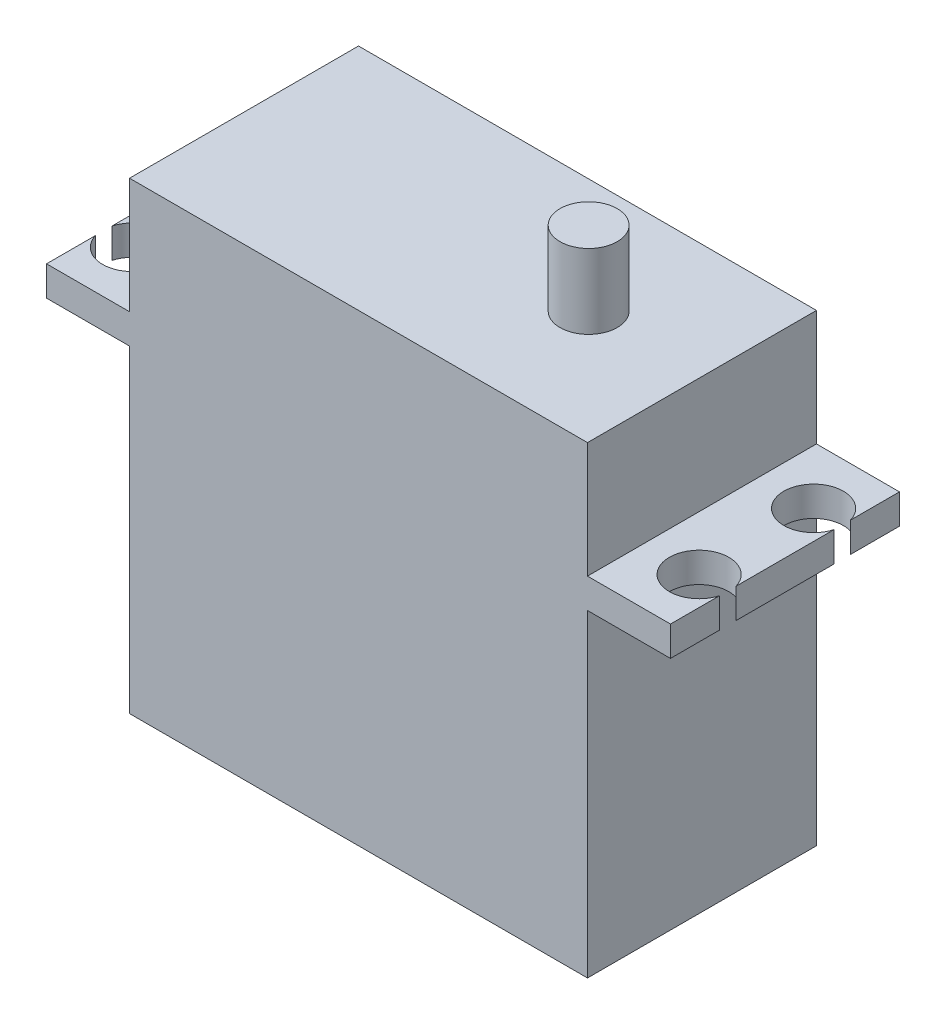
ISO-10303-21;
HEADER;
FILE_DESCRIPTION(('STEP AP214'),'2;1');
FILE_NAME('part.step','',(''),(''),'','','');
FILE_SCHEMA(('AUTOMOTIVE_DESIGN { 1 0 10303 214 1 1 1 1 }'));
ENDSEC;
DATA;
#1=APPLICATION_CONTEXT('core data for automotive mechanical design processes');
#2=APPLICATION_PROTOCOL_DEFINITION('international standard','automotive_design',2000,#1);
#3=PRODUCT_CONTEXT('',#1,'mechanical');
#4=PRODUCT('Part','Part','',(#3));
#5=PRODUCT_RELATED_PRODUCT_CATEGORY('part','',(#4));
#6=PRODUCT_DEFINITION_FORMATION('','',#4);
#7=PRODUCT_DEFINITION_CONTEXT('part definition',#1,'design');
#8=PRODUCT_DEFINITION('design','',#6,#7);
#9=PRODUCT_DEFINITION_SHAPE('','',#8);
#10=(LENGTH_UNIT() NAMED_UNIT(*) SI_UNIT(.MILLI.,.METRE.));
#11=(NAMED_UNIT(*) PLANE_ANGLE_UNIT() SI_UNIT($,.RADIAN.));
#12=(NAMED_UNIT(*) SI_UNIT($,.STERADIAN.) SOLID_ANGLE_UNIT());
#13=UNCERTAINTY_MEASURE_WITH_UNIT(LENGTH_MEASURE(1.E-05),#10,'distance_accuracy_value','');
#14=(GEOMETRIC_REPRESENTATION_CONTEXT(3) GLOBAL_UNCERTAINTY_ASSIGNED_CONTEXT((#13)) GLOBAL_UNIT_ASSIGNED_CONTEXT((#10,
#11,#12)) REPRESENTATION_CONTEXT('',''));
#15=CARTESIAN_POINT('',(0.,0.,0.));
#16=DIRECTION('',(0.,0.,1.));
#17=DIRECTION('',(1.,0.,0.));
#18=AXIS2_PLACEMENT_3D('',#15,#16,#17);
#19=CARTESIAN_POINT('',(-7.25,0.,0.));
#20=DIRECTION('',(-1.,0.,0.));
#21=DIRECTION('',(0.,0.,1.));
#22=AXIS2_PLACEMENT_3D('',#19,#20,#21);
#23=PLANE('',#22);
#24=DIRECTION('',(0.,1.,0.));
#25=VECTOR('',#24,1.);
#26=CARTESIAN_POINT('',(-7.25,23.15,15.7141428428543));
#27=LINE('',#26,#25);
#28=CARTESIAN_POINT('',(-7.25,27.8,15.7141428428543));
#29=VERTEX_POINT('',#28);
#30=CARTESIAN_POINT('',(-7.25,30.4,15.7141428428543));
#31=VERTEX_POINT('',#30);
#32=EDGE_CURVE('E11',#29,#31,#27,.T.);
#33=ORIENTED_EDGE('',*,*,#32,.F.);
#34=DIRECTION('',(0.,0.,-1.));
#35=VECTOR('',#34,1.);
#36=CARTESIAN_POINT('',(-7.25,27.8,0.));
#37=LINE('',#36,#35);
#38=CARTESIAN_POINT('',(-7.25,27.8,20.));
#39=VERTEX_POINT('',#38);
#40=EDGE_CURVE('E238',#39,#29,#37,.T.);
#41=ORIENTED_EDGE('',*,*,#40,.F.);
#42=DIRECTION('',(0.,1.,0.));
#43=VECTOR('',#42,1.);
#44=CARTESIAN_POINT('',(-7.25,0.,20.));
#45=LINE('',#44,#43);
#46=CARTESIAN_POINT('',(-7.25,30.4,20.));
#47=VERTEX_POINT('',#46);
#48=EDGE_CURVE('E241',#39,#47,#45,.T.);
#49=ORIENTED_EDGE('',*,*,#48,.T.);
#50=DIRECTION('',(0.,0.,1.));
#51=VECTOR('',#50,1.);
#52=CARTESIAN_POINT('',(-7.25,30.4,0.));
#53=LINE('',#52,#51);
#54=EDGE_CURVE('E234',#31,#47,#53,.T.);
#55=ORIENTED_EDGE('',*,*,#54,.F.);
#56=EDGE_LOOP('',(#33,#41,#49,#55));
#57=FACE_BOUND('',#56,.T.);
#58=ADVANCED_FACE('F34',(#57),#23,.T.);
#59=DIRECTION('',(0.,1.,0.));
#60=VECTOR('',#59,1.);
#61=CARTESIAN_POINT('',(-7.25,23.15,14.2858571571457));
#62=LINE('',#61,#60);
#63=CARTESIAN_POINT('',(-7.25,30.4,14.2858571571457));
#64=VERTEX_POINT('',#63);
#65=CARTESIAN_POINT('',(-7.25,27.8,14.2858571571457));
#66=VERTEX_POINT('',#65);
#67=EDGE_CURVE('E42',#64,#66,#62,.F.);
#68=ORIENTED_EDGE('',*,*,#67,.F.);
#69=CARTESIAN_POINT('',(-7.25,30.4,5.71414284285429));
#70=VERTEX_POINT('',#69);
#71=EDGE_CURVE('E233',#70,#64,#53,.T.);
#72=ORIENTED_EDGE('',*,*,#71,.F.);
#73=DIRECTION('',(0.,1.,0.));
#74=VECTOR('',#73,1.);
#75=CARTESIAN_POINT('',(-7.25,23.15,5.71414284285429));
#76=LINE('',#75,#74);
#77=CARTESIAN_POINT('',(-7.25,27.8,5.71414284285429));
#78=VERTEX_POINT('',#77);
#79=EDGE_CURVE('E306',#78,#70,#76,.T.);
#80=ORIENTED_EDGE('',*,*,#79,.F.);
#81=EDGE_CURVE('E242',#66,#78,#37,.T.);
#82=ORIENTED_EDGE('',*,*,#81,.F.);
#83=EDGE_LOOP('',(#68,#72,#80,#82));
#84=FACE_BOUND('',#83,.T.);
#85=ADVANCED_FACE('F321',(#84),#23,.T.);
#86=CARTESIAN_POINT('',(47.25,0.,0.));
#87=DIRECTION('',(1.,0.,0.));
#88=DIRECTION('',(0.,0.,-1.));
#89=AXIS2_PLACEMENT_3D('',#86,#87,#88);
#90=PLANE('',#89);
#91=DIRECTION('',(0.,1.,0.));
#92=VECTOR('',#91,1.);
#93=CARTESIAN_POINT('',(47.25,23.15,4.28585715714574));
#94=LINE('',#93,#92);
#95=CARTESIAN_POINT('',(47.25,27.8,4.28585715714573));
#96=VERTEX_POINT('',#95);
#97=CARTESIAN_POINT('',(47.25,30.4,4.28585715714574));
#98=VERTEX_POINT('',#97);
#99=EDGE_CURVE('E302',#96,#98,#94,.T.);
#100=ORIENTED_EDGE('',*,*,#99,.F.);
#101=DIRECTION('',(0.,0.,-1.));
#102=VECTOR('',#101,1.);
#103=CARTESIAN_POINT('',(47.25,27.8,0.));
#104=LINE('',#103,#102);
#105=CARTESIAN_POINT('',(47.25,27.8,0.));
#106=VERTEX_POINT('',#105);
#107=EDGE_CURVE('E204',#96,#106,#104,.T.);
#108=ORIENTED_EDGE('',*,*,#107,.T.);
#109=DIRECTION('',(0.,1.,0.));
#110=VECTOR('',#109,1.);
#111=CARTESIAN_POINT('',(47.25,0.,0.));
#112=LINE('',#111,#110);
#113=CARTESIAN_POINT('',(47.25,30.4,0.));
#114=VERTEX_POINT('',#113);
#115=EDGE_CURVE('E199',#106,#114,#112,.T.);
#116=ORIENTED_EDGE('',*,*,#115,.T.);
#117=DIRECTION('',(0.,0.,1.));
#118=VECTOR('',#117,1.);
#119=CARTESIAN_POINT('',(47.25,30.4,0.));
#120=LINE('',#119,#118);
#121=EDGE_CURVE('E195',#114,#98,#120,.T.);
#122=ORIENTED_EDGE('',*,*,#121,.T.);
#123=EDGE_LOOP('',(#100,#108,#116,#122));
#124=FACE_BOUND('',#123,.T.);
#125=ADVANCED_FACE('F372',(#124),#90,.T.);
#126=DIRECTION('',(0.,1.,0.));
#127=VECTOR('',#126,1.);
#128=CARTESIAN_POINT('',(47.25,23.15,5.71414284285426));
#129=LINE('',#128,#127);
#130=CARTESIAN_POINT('',(47.25,30.4,5.71414284285426));
#131=VERTEX_POINT('',#130);
#132=CARTESIAN_POINT('',(47.25,27.8,5.71414284285426));
#133=VERTEX_POINT('',#132);
#134=EDGE_CURVE('E180',#131,#133,#129,.F.);
#135=ORIENTED_EDGE('',*,*,#134,.F.);
#136=CARTESIAN_POINT('',(47.25,30.4,14.2858571571457));
#137=VERTEX_POINT('',#136);
#138=EDGE_CURVE('E188',#131,#137,#120,.T.);
#139=ORIENTED_EDGE('',*,*,#138,.T.);
#140=DIRECTION('',(0.,1.,0.));
#141=VECTOR('',#140,1.);
#142=CARTESIAN_POINT('',(47.25,23.15,14.2858571571457));
#143=LINE('',#142,#141);
#144=CARTESIAN_POINT('',(47.25,27.8,14.2858571571457));
#145=VERTEX_POINT('',#144);
#146=EDGE_CURVE('E169',#145,#137,#143,.T.);
#147=ORIENTED_EDGE('',*,*,#146,.F.);
#148=EDGE_CURVE('E209',#145,#133,#104,.T.);
#149=ORIENTED_EDGE('',*,*,#148,.T.);
#150=EDGE_LOOP('',(#135,#139,#147,#149));
#151=FACE_BOUND('',#150,.T.);
#152=ADVANCED_FACE('F194',(#151),#90,.T.);
#153=CARTESIAN_POINT('',(40.,40.5,0.));
#154=DIRECTION('',(-1.,0.,0.));
#155=DIRECTION('',(0.,0.,1.));
#156=AXIS2_PLACEMENT_3D('',#153,#154,#155);
#157=PLANE('',#156);
#158=DIRECTION('',(0.,0.,-1.));
#159=VECTOR('',#158,1.);
#160=CARTESIAN_POINT('',(40.,27.8,0.));
#161=LINE('',#160,#159);
#162=CARTESIAN_POINT('',(40.,27.8,20.));
#163=VERTEX_POINT('',#162);
#164=CARTESIAN_POINT('',(40.,27.8,0.));
#165=VERTEX_POINT('',#164);
#166=EDGE_CURVE('E213',#163,#165,#161,.T.);
#167=ORIENTED_EDGE('',*,*,#166,.F.);
#168=DIRECTION('',(0.,-1.,0.));
#169=VECTOR('',#168,1.);
#170=CARTESIAN_POINT('',(40.,40.5,20.));
#171=LINE('',#170,#169);
#172=CARTESIAN_POINT('',(40.,0.,20.));
#173=VERTEX_POINT('',#172);
#174=EDGE_CURVE('E293',#163,#173,#171,.T.);
#175=ORIENTED_EDGE('',*,*,#174,.T.);
#176=DIRECTION('',(0.,0.,-1.));
#177=VECTOR('',#176,1.);
#178=CARTESIAN_POINT('',(40.,0.,0.));
#179=LINE('',#178,#177);
#180=CARTESIAN_POINT('',(40.,0.,0.));
#181=VERTEX_POINT('',#180);
#182=EDGE_CURVE('E281',#173,#181,#179,.T.);
#183=ORIENTED_EDGE('',*,*,#182,.T.);
#184=DIRECTION('',(0.,-1.,0.));
#185=VECTOR('',#184,1.);
#186=CARTESIAN_POINT('',(40.,40.5,0.));
#187=LINE('',#186,#185);
#188=EDGE_CURVE('E289',#165,#181,#187,.T.);
#189=ORIENTED_EDGE('',*,*,#188,.F.);
#190=EDGE_LOOP('',(#167,#175,#183,#189));
#191=FACE_BOUND('',#190,.T.);
#192=ADVANCED_FACE('F381',(#191),#157,.F.);
#193=DIRECTION('',(0.,0.,1.));
#194=VECTOR('',#193,1.);
#195=CARTESIAN_POINT('',(40.,30.4,0.));
#196=LINE('',#195,#194);
#197=CARTESIAN_POINT('',(40.,30.4,0.));
#198=VERTEX_POINT('',#197);
#199=CARTESIAN_POINT('',(40.,30.4,20.));
#200=VERTEX_POINT('',#199);
#201=EDGE_CURVE('E210',#198,#200,#196,.T.);
#202=ORIENTED_EDGE('',*,*,#201,.F.);
#203=CARTESIAN_POINT('',(40.,40.5,0.));
#204=VERTEX_POINT('',#203);
#205=EDGE_CURVE('E290',#204,#198,#187,.T.);
#206=ORIENTED_EDGE('',*,*,#205,.F.);
#207=DIRECTION('',(0.,0.,-1.));
#208=VECTOR('',#207,1.);
#209=CARTESIAN_POINT('',(40.,40.5,0.));
#210=LINE('',#209,#208);
#211=CARTESIAN_POINT('',(40.,40.5,20.));
#212=VERTEX_POINT('',#211);
#213=EDGE_CURVE('E271',#212,#204,#210,.T.);
#214=ORIENTED_EDGE('',*,*,#213,.F.);
#215=EDGE_CURVE('E294',#212,#200,#171,.T.);
#216=ORIENTED_EDGE('',*,*,#215,.T.);
#217=EDGE_LOOP('',(#202,#206,#214,#216));
#218=FACE_BOUND('',#217,.T.);
#219=ADVANCED_FACE('F366',(#218),#157,.F.);
#220=CARTESIAN_POINT('',(0.,40.5,0.));
#221=DIRECTION('',(1.,0.,0.));
#222=DIRECTION('',(0.,0.,-1.));
#223=AXIS2_PLACEMENT_3D('',#220,#221,#222);
#224=PLANE('',#223);
#225=DIRECTION('',(0.,-1.,0.));
#226=VECTOR('',#225,1.);
#227=CARTESIAN_POINT('',(0.,40.5,0.));
#228=LINE('',#227,#226);
#229=CARTESIAN_POINT('',(0.,40.5,0.));
#230=VERTEX_POINT('',#229);
#231=CARTESIAN_POINT('',(0.,30.4,0.));
#232=VERTEX_POINT('',#231);
#233=EDGE_CURVE('E286',#230,#232,#228,.T.);
#234=ORIENTED_EDGE('',*,*,#233,.T.);
#235=DIRECTION('',(0.,0.,1.));
#236=VECTOR('',#235,1.);
#237=CARTESIAN_POINT('',(0.,30.4,0.));
#238=LINE('',#237,#236);
#239=CARTESIAN_POINT('',(0.,30.4,20.));
#240=VERTEX_POINT('',#239);
#241=EDGE_CURVE('E228',#232,#240,#238,.T.);
#242=ORIENTED_EDGE('',*,*,#241,.T.);
#243=DIRECTION('',(0.,-1.,0.));
#244=VECTOR('',#243,1.);
#245=CARTESIAN_POINT('',(0.,40.5,20.));
#246=LINE('',#245,#244);
#247=CARTESIAN_POINT('',(0.,40.5,20.));
#248=VERTEX_POINT('',#247);
#249=EDGE_CURVE('E297',#248,#240,#246,.T.);
#250=ORIENTED_EDGE('',*,*,#249,.F.);
#251=DIRECTION('',(0.,0.,1.));
#252=VECTOR('',#251,1.);
#253=CARTESIAN_POINT('',(0.,40.5,0.));
#254=LINE('',#253,#252);
#255=EDGE_CURVE('E265',#230,#248,#254,.T.);
#256=ORIENTED_EDGE('',*,*,#255,.F.);
#257=EDGE_LOOP('',(#234,#242,#250,#256));
#258=FACE_BOUND('',#257,.T.);
#259=ADVANCED_FACE('F359',(#258),#224,.F.);
#260=CARTESIAN_POINT('',(0.,27.8,20.));
#261=VERTEX_POINT('',#260);
#262=CARTESIAN_POINT('',(0.,0.,20.));
#263=VERTEX_POINT('',#262);
#264=EDGE_CURVE('E296',#261,#263,#246,.T.);
#265=ORIENTED_EDGE('',*,*,#264,.F.);
#266=DIRECTION('',(0.,0.,-1.));
#267=VECTOR('',#266,1.);
#268=CARTESIAN_POINT('',(0.,27.8,0.));
#269=LINE('',#268,#267);
#270=CARTESIAN_POINT('',(0.,27.8,0.));
#271=VERTEX_POINT('',#270);
#272=EDGE_CURVE('E248',#261,#271,#269,.T.);
#273=ORIENTED_EDGE('',*,*,#272,.T.);
#274=CARTESIAN_POINT('',(0.,0.,0.));
#275=VERTEX_POINT('',#274);
#276=EDGE_CURVE('E275',#271,#275,#228,.T.);
#277=ORIENTED_EDGE('',*,*,#276,.T.);
#278=DIRECTION('',(0.,0.,1.));
#279=VECTOR('',#278,1.);
#280=CARTESIAN_POINT('',(0.,0.,0.));
#281=LINE('',#280,#279);
#282=EDGE_CURVE('E262',#275,#263,#281,.T.);
#283=ORIENTED_EDGE('',*,*,#282,.T.);
#284=EDGE_LOOP('',(#265,#273,#277,#283));
#285=FACE_BOUND('',#284,.T.);
#286=ADVANCED_FACE('F36',(#285),#224,.F.);
#287=CARTESIAN_POINT('',(0.,40.5,20.));
#288=DIRECTION('',(0.,0.,-1.));
#289=DIRECTION('',(-1.,0.,0.));
#290=AXIS2_PLACEMENT_3D('',#287,#288,#289);
#291=PLANE('',#290);
#292=DIRECTION('',(1.,0.,0.));
#293=VECTOR('',#292,1.);
#294=CARTESIAN_POINT('',(0.,0.,20.));
#295=LINE('',#294,#293);
#296=EDGE_CURVE('E278',#263,#173,#295,.T.);
#297=ORIENTED_EDGE('',*,*,#296,.T.);
#298=ORIENTED_EDGE('',*,*,#174,.F.);
#299=DIRECTION('',(-1.,0.,0.));
#300=VECTOR('',#299,1.);
#301=CARTESIAN_POINT('',(47.25,27.8,20.));
#302=LINE('',#301,#300);
#303=CARTESIAN_POINT('',(47.25,27.8,20.));
#304=VERTEX_POINT('',#303);
#305=EDGE_CURVE('E219',#304,#163,#302,.T.);
#306=ORIENTED_EDGE('',*,*,#305,.F.);
#307=DIRECTION('',(0.,-1.,0.));
#308=VECTOR('',#307,1.);
#309=CARTESIAN_POINT('',(47.25,0.,20.));
#310=LINE('',#309,#308);
#311=CARTESIAN_POINT('',(47.25,30.4,20.));
#312=VERTEX_POINT('',#311);
#313=EDGE_CURVE('E198',#312,#304,#310,.T.);
#314=ORIENTED_EDGE('',*,*,#313,.F.);
#315=DIRECTION('',(-1.,0.,0.));
#316=VECTOR('',#315,1.);
#317=CARTESIAN_POINT('',(47.25,30.4,20.));
#318=LINE('',#317,#316);
#319=EDGE_CURVE('E222',#312,#200,#318,.T.);
#320=ORIENTED_EDGE('',*,*,#319,.T.);
#321=ORIENTED_EDGE('',*,*,#215,.F.);
#322=DIRECTION('',(1.,0.,0.));
#323=VECTOR('',#322,1.);
#324=CARTESIAN_POINT('',(0.,40.5,20.));
#325=LINE('',#324,#323);
#326=EDGE_CURVE('E268',#248,#212,#325,.T.);
#327=ORIENTED_EDGE('',*,*,#326,.F.);
#328=ORIENTED_EDGE('',*,*,#249,.T.);
#329=DIRECTION('',(1.,0.,0.));
#330=VECTOR('',#329,1.);
#331=CARTESIAN_POINT('',(-7.25,30.4,20.));
#332=LINE('',#331,#330);
#333=EDGE_CURVE('E245',#47,#240,#332,.T.);
#334=ORIENTED_EDGE('',*,*,#333,.F.);
#335=ORIENTED_EDGE('',*,*,#48,.F.);
#336=DIRECTION('',(1.,0.,0.));
#337=VECTOR('',#336,1.);
#338=CARTESIAN_POINT('',(-7.25,27.8,20.));
#339=LINE('',#338,#337);
#340=EDGE_CURVE('E252',#39,#261,#339,.T.);
#341=ORIENTED_EDGE('',*,*,#340,.T.);
#342=ORIENTED_EDGE('',*,*,#264,.T.);
#343=EDGE_LOOP('',(#297,#298,#306,#314,#320,#321,#327,#328,#334,#335,#341,#342));
#344=FACE_BOUND('',#343,.T.);
#345=ADVANCED_FACE('F339',(#344),#291,.F.);
#346=CARTESIAN_POINT('',(0.,40.5,0.));
#347=DIRECTION('',(0.,0.,1.));
#348=DIRECTION('',(1.,0.,0.));
#349=AXIS2_PLACEMENT_3D('',#346,#347,#348);
#350=PLANE('',#349);
#351=DIRECTION('',(-1.,0.,0.));
#352=VECTOR('',#351,1.);
#353=CARTESIAN_POINT('',(0.,0.,0.));
#354=LINE('',#353,#352);
#355=EDGE_CURVE('E269',#181,#275,#354,.T.);
#356=ORIENTED_EDGE('',*,*,#355,.T.);
#357=ORIENTED_EDGE('',*,*,#276,.F.);
#358=DIRECTION('',(1.,0.,0.));
#359=VECTOR('',#358,1.);
#360=CARTESIAN_POINT('',(-7.25,27.8,0.));
#361=LINE('',#360,#359);
#362=CARTESIAN_POINT('',(-7.25,27.8,0.));
#363=VERTEX_POINT('',#362);
#364=EDGE_CURVE('E254',#363,#271,#361,.T.);
#365=ORIENTED_EDGE('',*,*,#364,.F.);
#366=DIRECTION('',(0.,-1.,0.));
#367=VECTOR('',#366,1.);
#368=CARTESIAN_POINT('',(-7.25,0.,0.));
#369=LINE('',#368,#367);
#370=CARTESIAN_POINT('',(-7.25,30.4,0.));
#371=VERTEX_POINT('',#370);
#372=EDGE_CURVE('E232',#371,#363,#369,.T.);
#373=ORIENTED_EDGE('',*,*,#372,.F.);
#374=DIRECTION('',(1.,0.,0.));
#375=VECTOR('',#374,1.);
#376=CARTESIAN_POINT('',(-7.25,30.4,0.));
#377=LINE('',#376,#375);
#378=EDGE_CURVE('E256',#371,#232,#377,.T.);
#379=ORIENTED_EDGE('',*,*,#378,.T.);
#380=ORIENTED_EDGE('',*,*,#233,.F.);
#381=DIRECTION('',(-1.,0.,0.));
#382=VECTOR('',#381,1.);
#383=CARTESIAN_POINT('',(0.,40.5,0.));
#384=LINE('',#383,#382);
#385=EDGE_CURVE('E273',#204,#230,#384,.T.);
#386=ORIENTED_EDGE('',*,*,#385,.F.);
#387=ORIENTED_EDGE('',*,*,#205,.T.);
#388=DIRECTION('',(-1.,0.,0.));
#389=VECTOR('',#388,1.);
#390=CARTESIAN_POINT('',(47.25,30.4,0.));
#391=LINE('',#390,#389);
#392=EDGE_CURVE('E225',#114,#198,#391,.T.);
#393=ORIENTED_EDGE('',*,*,#392,.F.);
#394=ORIENTED_EDGE('',*,*,#115,.F.);
#395=DIRECTION('',(-1.,0.,0.));
#396=VECTOR('',#395,1.);
#397=CARTESIAN_POINT('',(47.25,27.8,0.));
#398=LINE('',#397,#396);
#399=EDGE_CURVE('E208',#106,#165,#398,.T.);
#400=ORIENTED_EDGE('',*,*,#399,.T.);
#401=ORIENTED_EDGE('',*,*,#188,.T.);
#402=EDGE_LOOP('',(#356,#357,#365,#373,#379,#380,#386,#387,#393,#394,#400,#401));
#403=FACE_BOUND('',#402,.T.);
#404=ADVANCED_FACE('F331',(#403),#350,.F.);
#405=CARTESIAN_POINT('',(0.,40.5,0.));
#406=DIRECTION('',(0.,1.,0.));
#407=DIRECTION('',(0.,0.,1.));
#408=AXIS2_PLACEMENT_3D('',#405,#406,#407);
#409=PLANE('',#408);
#410=CARTESIAN_POINT('',(30.1,40.5,10.));
#411=DIRECTION('',(0.,1.,0.));
#412=DIRECTION('',(0.,0.,1.));
#413=AXIS2_PLACEMENT_3D('',#410,#411,#412);
#414=CIRCLE('',#413,2.5);
#415=CARTESIAN_POINT('',(30.1,40.5,7.5));
#416=VERTEX_POINT('',#415);
#417=EDGE_CURVE('E258',#416,#416,#414,.T.);
#418=ORIENTED_EDGE('',*,*,#417,.F.);
#419=EDGE_LOOP('',(#418));
#420=FACE_BOUND('',#419,.T.);
#421=ORIENTED_EDGE('',*,*,#255,.T.);
#422=ORIENTED_EDGE('',*,*,#326,.T.);
#423=ORIENTED_EDGE('',*,*,#213,.T.);
#424=ORIENTED_EDGE('',*,*,#385,.T.);
#425=EDGE_LOOP('',(#421,#422,#423,#424));
#426=FACE_BOUND('',#425,.T.);
#427=ADVANCED_FACE('F361',(#420,#426),#409,.T.);
#428=CARTESIAN_POINT('',(0.,0.,0.));
#429=DIRECTION('',(0.,1.,0.));
#430=DIRECTION('',(0.,0.,1.));
#431=AXIS2_PLACEMENT_3D('',#428,#429,#430);
#432=PLANE('',#431);
#433=ORIENTED_EDGE('',*,*,#282,.F.);
#434=ORIENTED_EDGE('',*,*,#355,.F.);
#435=ORIENTED_EDGE('',*,*,#182,.F.);
#436=ORIENTED_EDGE('',*,*,#296,.F.);
#437=EDGE_LOOP('',(#433,#434,#435,#436));
#438=FACE_BOUND('',#437,.T.);
#439=ADVANCED_FACE('F386',(#438),#432,.F.);
#440=CARTESIAN_POINT('',(30.1,47.,10.));
#441=DIRECTION('',(0.,-1.,0.));
#442=DIRECTION('',(0.,0.,-1.));
#443=AXIS2_PLACEMENT_3D('',#440,#441,#442);
#444=CYLINDRICAL_SURFACE('',#443,2.5);
#445=CARTESIAN_POINT('',(30.1,47.,10.));
#446=DIRECTION('',(0.,1.,0.));
#447=DIRECTION('',(0.,0.,1.));
#448=AXIS2_PLACEMENT_3D('',#445,#446,#447);
#449=CIRCLE('',#448,2.5);
#450=CARTESIAN_POINT('',(30.1,47.,7.5));
#451=VERTEX_POINT('',#450);
#452=EDGE_CURVE('E259',#451,#451,#449,.T.);
#453=CARTESIAN_POINT('',(30.1,47.,7.5));
#454=CARTESIAN_POINT('',(30.1,46.9322916666667,7.5));
#455=CARTESIAN_POINT('',(30.1,46.8645833333333,7.5));
#456=CARTESIAN_POINT('',(30.1,46.7291666666667,7.5));
#457=CARTESIAN_POINT('',(30.1,46.6614583333333,7.5));
#458=CARTESIAN_POINT('',(30.1,46.5260416666667,7.5));
#459=CARTESIAN_POINT('',(30.1,46.4583333333333,7.5));
#460=CARTESIAN_POINT('',(30.1,46.3229166666667,7.5));
#461=CARTESIAN_POINT('',(30.1,46.2552083333333,7.5));
#462=CARTESIAN_POINT('',(30.1,46.1197916666667,7.5));
#463=CARTESIAN_POINT('',(30.1,46.0520833333333,7.5));
#464=CARTESIAN_POINT('',(30.1,45.9166666666667,7.5));
#465=CARTESIAN_POINT('',(30.1,45.8489583333333,7.5));
#466=CARTESIAN_POINT('',(30.1,45.7135416666667,7.5));
#467=CARTESIAN_POINT('',(30.1,45.6458333333333,7.5));
#468=CARTESIAN_POINT('',(30.1,45.5104166666667,7.5));
#469=CARTESIAN_POINT('',(30.1,45.4427083333333,7.5));
#470=CARTESIAN_POINT('',(30.1,45.3072916666667,7.5));
#471=CARTESIAN_POINT('',(30.1,45.2395833333333,7.5));
#472=CARTESIAN_POINT('',(30.1,45.1041666666667,7.5));
#473=CARTESIAN_POINT('',(30.1,45.0364583333333,7.5));
#474=CARTESIAN_POINT('',(30.1,44.9010416666667,7.5));
#475=CARTESIAN_POINT('',(30.1,44.8333333333333,7.5));
#476=CARTESIAN_POINT('',(30.1,44.6979166666667,7.5));
#477=CARTESIAN_POINT('',(30.1,44.6302083333333,7.5));
#478=CARTESIAN_POINT('',(30.1,44.4947916666667,7.5));
#479=CARTESIAN_POINT('',(30.1,44.4270833333333,7.5));
#480=CARTESIAN_POINT('',(30.1,44.2916666666667,7.5));
#481=CARTESIAN_POINT('',(30.1,44.2239583333333,7.5));
#482=CARTESIAN_POINT('',(30.1,44.0885416666667,7.5));
#483=CARTESIAN_POINT('',(30.1,44.0208333333333,7.5));
#484=CARTESIAN_POINT('',(30.1,43.8854166666667,7.5));
#485=CARTESIAN_POINT('',(30.1,43.8177083333333,7.5));
#486=CARTESIAN_POINT('',(30.1,43.6822916666667,7.5));
#487=CARTESIAN_POINT('',(30.1,43.6145833333333,7.5));
#488=CARTESIAN_POINT('',(30.1,43.4791666666667,7.5));
#489=CARTESIAN_POINT('',(30.1,43.4114583333333,7.5));
#490=CARTESIAN_POINT('',(30.1,43.2760416666667,7.5));
#491=CARTESIAN_POINT('',(30.1,43.2083333333333,7.5));
#492=CARTESIAN_POINT('',(30.1,43.0729166666667,7.5));
#493=CARTESIAN_POINT('',(30.1,43.0052083333333,7.5));
#494=CARTESIAN_POINT('',(30.1,42.8697916666667,7.5));
#495=CARTESIAN_POINT('',(30.1,42.8020833333333,7.5));
#496=CARTESIAN_POINT('',(30.1,42.6666666666667,7.5));
#497=CARTESIAN_POINT('',(30.1,42.5989583333333,7.5));
#498=CARTESIAN_POINT('',(30.1,42.4635416666667,7.5));
#499=CARTESIAN_POINT('',(30.1,42.3958333333333,7.5));
#500=CARTESIAN_POINT('',(30.1,42.2604166666667,7.5));
#501=CARTESIAN_POINT('',(30.1,42.1927083333333,7.5));
#502=CARTESIAN_POINT('',(30.1,42.0572916666667,7.5));
#503=CARTESIAN_POINT('',(30.1,41.9895833333333,7.5));
#504=CARTESIAN_POINT('',(30.1,41.8541666666667,7.5));
#505=CARTESIAN_POINT('',(30.1,41.7864583333333,7.5));
#506=CARTESIAN_POINT('',(30.1,41.6510416666667,7.5));
#507=CARTESIAN_POINT('',(30.1,41.5833333333333,7.5));
#508=CARTESIAN_POINT('',(30.1,41.4479166666667,7.5));
#509=CARTESIAN_POINT('',(30.1,41.3802083333333,7.5));
#510=CARTESIAN_POINT('',(30.1,41.2447916666667,7.5));
#511=CARTESIAN_POINT('',(30.1,41.1770833333333,7.5));
#512=CARTESIAN_POINT('',(30.1,41.0416666666667,7.5));
#513=CARTESIAN_POINT('',(30.1,40.9739583333333,7.5));
#514=CARTESIAN_POINT('',(30.1,40.8385416666667,7.5));
#515=CARTESIAN_POINT('',(30.1,40.7708333333333,7.5));
#516=CARTESIAN_POINT('',(30.1,40.6354166666667,7.5));
#517=CARTESIAN_POINT('',(30.1,40.5677083333333,7.5));
#518=CARTESIAN_POINT('',(30.1,40.5,7.5));
#519=B_SPLINE_CURVE_WITH_KNOTS('',3,(#453,#454,#455,#456,#457,#458,#459,#460,#461,#462,#463,
#464,#465,#466,#467,#468,#469,#470,#471,#472,#473,#474,#475,#476,#477,#478,#479,#480,#481,#482,
#483,#484,#485,#486,#487,#488,#489,#490,#491,#492,#493,#494,#495,#496,#497,#498,#499,#500,#501,
#502,#503,#504,#505,#506,#507,#508,#509,#510,#511,#512,#513,#514,#515,#516,#517,#518),
.UNSPECIFIED.,.F.,.F.,(4,2,2,2,2,2,2,2,2,2,2,2,2,2,2,2,2,2,2,2,2,2,2,2,2,2,2,2,2,2,2,2,4),(0.,
0.203124999999998,0.406249999999997,0.609374999999995,0.812499999999994,1.015625,1.21875,
1.421875,1.62499999999999,1.82812499999999,2.03125,2.234375,2.4375,2.64062499999999,2.84375,
3.046875,3.25,3.45312499999999,3.65624999999999,3.859375,4.0625,4.26562499999999,
4.46874999999999,4.67187499999999,4.875,5.078125,5.28124999999999,5.48437499999999,
5.68749999999999,5.890625,6.09374999999999,6.29687499999999,6.49999999999999),.UNSPECIFIED.);
#520=EDGE_CURVE('BSEAM388',#451,#416,#519,.T.);
#521=ORIENTED_EDGE('',*,*,#452,.F.);
#522=ORIENTED_EDGE('',*,*,#417,.T.);
#523=ORIENTED_EDGE('',*,*,#520,.T.);
#524=ORIENTED_EDGE('',*,*,#520,.F.);
#525=EDGE_LOOP('',(#521,#523,#522,#524));
#526=FACE_BOUND('',#525,.T.);
#527=ADVANCED_FACE('F388',(#526),#444,.T.);
#528=CARTESIAN_POINT('',(0.,47.,0.));
#529=DIRECTION('',(0.,1.,0.));
#530=DIRECTION('',(0.,0.,1.));
#531=AXIS2_PLACEMENT_3D('',#528,#529,#530);
#532=PLANE('',#531);
#533=ORIENTED_EDGE('',*,*,#452,.T.);
#534=EDGE_LOOP('',(#533));
#535=FACE_BOUND('',#534,.T.);
#536=ADVANCED_FACE('F394',(#535),#532,.T.);
#537=CARTESIAN_POINT('',(-7.25,30.4,0.));
#538=DIRECTION('',(0.,1.,0.));
#539=DIRECTION('',(0.,0.,1.));
#540=AXIS2_PLACEMENT_3D('',#537,#538,#539);
#541=PLANE('',#540);
#542=CARTESIAN_POINT('',(-4.75,30.4,15.));
#543=DIRECTION('',(0.,1.,0.));
#544=DIRECTION('',(0.,0.,1.));
#545=AXIS2_PLACEMENT_3D('',#542,#543,#544);
#546=CIRCLE('',#545,2.6);
#547=EDGE_CURVE('E48',#31,#64,#546,.T.);
#548=ORIENTED_EDGE('',*,*,#547,.F.);
#549=ORIENTED_EDGE('',*,*,#54,.T.);
#550=ORIENTED_EDGE('',*,*,#333,.T.);
#551=ORIENTED_EDGE('',*,*,#241,.F.);
#552=ORIENTED_EDGE('',*,*,#378,.F.);
#553=CARTESIAN_POINT('',(-7.25,30.4,4.28585715714572));
#554=VERTEX_POINT('',#553);
#555=EDGE_CURVE('E229',#371,#554,#53,.T.);
#556=ORIENTED_EDGE('',*,*,#555,.T.);
#557=CARTESIAN_POINT('',(-4.75,30.4,5.));
#558=DIRECTION('',(0.,1.,0.));
#559=DIRECTION('',(0.,0.,1.));
#560=AXIS2_PLACEMENT_3D('',#557,#558,#559);
#561=CIRCLE('',#560,2.6);
#562=EDGE_CURVE('E56',#70,#554,#561,.T.);
#563=ORIENTED_EDGE('',*,*,#562,.F.);
#564=ORIENTED_EDGE('',*,*,#71,.T.);
#565=EDGE_LOOP('',(#548,#549,#550,#551,#552,#556,#563,#564));
#566=FACE_BOUND('',#565,.T.);
#567=ADVANCED_FACE('F343',(#566),#541,.T.);
#568=CARTESIAN_POINT('',(-7.25,27.8,0.));
#569=DIRECTION('',(0.,-1.,0.));
#570=DIRECTION('',(0.,0.,-1.));
#571=AXIS2_PLACEMENT_3D('',#568,#569,#570);
#572=PLANE('',#571);
#573=CARTESIAN_POINT('',(-4.75,27.8,15.));
#574=DIRECTION('',(0.,-1.,0.));
#575=DIRECTION('',(0.,0.,-1.));
#576=AXIS2_PLACEMENT_3D('',#573,#574,#575);
#577=CIRCLE('',#576,2.6);
#578=EDGE_CURVE('E214',#66,#29,#577,.T.);
#579=ORIENTED_EDGE('',*,*,#578,.F.);
#580=ORIENTED_EDGE('',*,*,#81,.T.);
#581=CARTESIAN_POINT('',(-4.75,27.8,5.));
#582=DIRECTION('',(0.,-1.,0.));
#583=DIRECTION('',(0.,0.,-1.));
#584=AXIS2_PLACEMENT_3D('',#581,#582,#583);
#585=CIRCLE('',#584,2.6);
#586=CARTESIAN_POINT('',(-7.25,27.8,4.28585715714571));
#587=VERTEX_POINT('',#586);
#588=EDGE_CURVE('E319',#587,#78,#585,.T.);
#589=ORIENTED_EDGE('',*,*,#588,.F.);
#590=EDGE_CURVE('E237',#587,#363,#37,.T.);
#591=ORIENTED_EDGE('',*,*,#590,.T.);
#592=ORIENTED_EDGE('',*,*,#364,.T.);
#593=ORIENTED_EDGE('',*,*,#272,.F.);
#594=ORIENTED_EDGE('',*,*,#340,.F.);
#595=ORIENTED_EDGE('',*,*,#40,.T.);
#596=EDGE_LOOP('',(#579,#580,#589,#591,#592,#593,#594,#595));
#597=FACE_BOUND('',#596,.T.);
#598=ADVANCED_FACE('F316',(#597),#572,.T.);
#599=DIRECTION('',(0.,1.,0.));
#600=VECTOR('',#599,1.);
#601=CARTESIAN_POINT('',(-7.25,23.15,4.28585715714571));
#602=LINE('',#601,#600);
#603=EDGE_CURVE('E304',#554,#587,#602,.F.);
#604=ORIENTED_EDGE('',*,*,#603,.F.);
#605=ORIENTED_EDGE('',*,*,#555,.F.);
#606=ORIENTED_EDGE('',*,*,#372,.T.);
#607=ORIENTED_EDGE('',*,*,#590,.F.);
#608=EDGE_LOOP('',(#604,#605,#606,#607));
#609=FACE_BOUND('',#608,.T.);
#610=ADVANCED_FACE('F328',(#609),#23,.T.);
#611=CARTESIAN_POINT('',(47.25,30.4,0.));
#612=DIRECTION('',(0.,-1.,0.));
#613=DIRECTION('',(0.,0.,-1.));
#614=AXIS2_PLACEMENT_3D('',#611,#612,#613);
#615=PLANE('',#614);
#616=ORIENTED_EDGE('',*,*,#138,.F.);
#617=CARTESIAN_POINT('',(44.75,30.4,5.));
#618=DIRECTION('',(0.,1.,0.));
#619=DIRECTION('',(0.,0.,1.));
#620=AXIS2_PLACEMENT_3D('',#617,#618,#619);
#621=CIRCLE('',#620,2.6);
#622=EDGE_CURVE('E191',#98,#131,#621,.T.);
#623=ORIENTED_EDGE('',*,*,#622,.F.);
#624=ORIENTED_EDGE('',*,*,#121,.F.);
#625=ORIENTED_EDGE('',*,*,#392,.T.);
#626=ORIENTED_EDGE('',*,*,#201,.T.);
#627=ORIENTED_EDGE('',*,*,#319,.F.);
#628=CARTESIAN_POINT('',(47.25,30.4,15.7141428428543));
#629=VERTEX_POINT('',#628);
#630=EDGE_CURVE('E190',#629,#312,#120,.T.);
#631=ORIENTED_EDGE('',*,*,#630,.F.);
#632=CARTESIAN_POINT('',(44.75,30.4,15.));
#633=DIRECTION('',(0.,1.,0.));
#634=DIRECTION('',(0.,0.,1.));
#635=AXIS2_PLACEMENT_3D('',#632,#633,#634);
#636=CIRCLE('',#635,2.6);
#637=EDGE_CURVE('E172',#137,#629,#636,.T.);
#638=ORIENTED_EDGE('',*,*,#637,.F.);
#639=EDGE_LOOP('',(#616,#623,#624,#625,#626,#627,#631,#638));
#640=FACE_BOUND('',#639,.T.);
#641=ADVANCED_FACE('F186',(#640),#615,.F.);
#642=CARTESIAN_POINT('',(47.25,27.8,0.));
#643=DIRECTION('',(0.,1.,0.));
#644=DIRECTION('',(0.,0.,1.));
#645=AXIS2_PLACEMENT_3D('',#642,#643,#644);
#646=PLANE('',#645);
#647=ORIENTED_EDGE('',*,*,#107,.F.);
#648=CARTESIAN_POINT('',(44.75,27.8,5.));
#649=DIRECTION('',(0.,1.,0.));
#650=DIRECTION('',(0.,0.,1.));
#651=AXIS2_PLACEMENT_3D('',#648,#649,#650);
#652=CIRCLE('',#651,2.6);
#653=EDGE_CURVE('E349',#96,#133,#652,.T.);
#654=ORIENTED_EDGE('',*,*,#653,.T.);
#655=ORIENTED_EDGE('',*,*,#148,.F.);
#656=CARTESIAN_POINT('',(44.75,27.8,15.));
#657=DIRECTION('',(0.,1.,0.));
#658=DIRECTION('',(0.,0.,1.));
#659=AXIS2_PLACEMENT_3D('',#656,#657,#658);
#660=CIRCLE('',#659,2.6);
#661=CARTESIAN_POINT('',(47.25,27.8,15.7141428428543));
#662=VERTEX_POINT('',#661);
#663=EDGE_CURVE('E175',#145,#662,#660,.T.);
#664=ORIENTED_EDGE('',*,*,#663,.T.);
#665=EDGE_CURVE('E205',#304,#662,#104,.T.);
#666=ORIENTED_EDGE('',*,*,#665,.F.);
#667=ORIENTED_EDGE('',*,*,#305,.T.);
#668=ORIENTED_EDGE('',*,*,#166,.T.);
#669=ORIENTED_EDGE('',*,*,#399,.F.);
#670=EDGE_LOOP('',(#647,#654,#655,#664,#666,#667,#668,#669));
#671=FACE_BOUND('',#670,.T.);
#672=ADVANCED_FACE('F376',(#671),#646,.F.);
#673=DIRECTION('',(0.,1.,0.));
#674=VECTOR('',#673,1.);
#675=CARTESIAN_POINT('',(47.25,23.15,15.7141428428543));
#676=LINE('',#675,#674);
#677=EDGE_CURVE('E181',#629,#662,#676,.F.);
#678=ORIENTED_EDGE('',*,*,#677,.F.);
#679=ORIENTED_EDGE('',*,*,#630,.T.);
#680=ORIENTED_EDGE('',*,*,#313,.T.);
#681=ORIENTED_EDGE('',*,*,#665,.T.);
#682=EDGE_LOOP('',(#678,#679,#680,#681));
#683=FACE_BOUND('',#682,.T.);
#684=ADVANCED_FACE('F462',(#683),#90,.T.);
#685=CARTESIAN_POINT('',(44.75,23.15,15.));
#686=DIRECTION('',(0.,1.,0.));
#687=DIRECTION('',(0.,0.,1.));
#688=AXIS2_PLACEMENT_3D('',#685,#686,#687);
#689=CYLINDRICAL_SURFACE('',#688,2.6);
#690=ORIENTED_EDGE('',*,*,#146,.T.);
#691=ORIENTED_EDGE('',*,*,#637,.T.);
#692=ORIENTED_EDGE('',*,*,#677,.T.);
#693=ORIENTED_EDGE('',*,*,#663,.F.);
#694=EDGE_LOOP('',(#690,#691,#692,#693));
#695=FACE_BOUND('',#694,.T.);
#696=ADVANCED_FACE('F171',(#695),#689,.F.);
#697=CARTESIAN_POINT('',(44.75,23.15,5.));
#698=DIRECTION('',(0.,1.,0.));
#699=DIRECTION('',(0.,0.,1.));
#700=AXIS2_PLACEMENT_3D('',#697,#698,#699);
#701=CYLINDRICAL_SURFACE('',#700,2.6);
#702=ORIENTED_EDGE('',*,*,#99,.T.);
#703=ORIENTED_EDGE('',*,*,#622,.T.);
#704=ORIENTED_EDGE('',*,*,#134,.T.);
#705=ORIENTED_EDGE('',*,*,#653,.F.);
#706=EDGE_LOOP('',(#702,#703,#704,#705));
#707=FACE_BOUND('',#706,.T.);
#708=ADVANCED_FACE('F480',(#707),#701,.F.);
#709=CARTESIAN_POINT('',(-4.75,23.15,5.));
#710=DIRECTION('',(0.,1.,0.));
#711=DIRECTION('',(0.,0.,1.));
#712=AXIS2_PLACEMENT_3D('',#709,#710,#711);
#713=CYLINDRICAL_SURFACE('',#712,2.6);
#714=ORIENTED_EDGE('',*,*,#79,.T.);
#715=ORIENTED_EDGE('',*,*,#562,.T.);
#716=ORIENTED_EDGE('',*,*,#603,.T.);
#717=ORIENTED_EDGE('',*,*,#588,.T.);
#718=EDGE_LOOP('',(#714,#715,#716,#717));
#719=FACE_BOUND('',#718,.T.);
#720=ADVANCED_FACE('F352',(#719),#713,.F.);
#721=CARTESIAN_POINT('',(-4.75,23.15,15.));
#722=DIRECTION('',(0.,1.,0.));
#723=DIRECTION('',(0.,0.,1.));
#724=AXIS2_PLACEMENT_3D('',#721,#722,#723);
#725=CYLINDRICAL_SURFACE('',#724,2.6);
#726=ORIENTED_EDGE('',*,*,#32,.T.);
#727=ORIENTED_EDGE('',*,*,#547,.T.);
#728=ORIENTED_EDGE('',*,*,#67,.T.);
#729=ORIENTED_EDGE('',*,*,#578,.T.);
#730=EDGE_LOOP('',(#726,#727,#728,#729));
#731=FACE_BOUND('',#730,.T.);
#732=ADVANCED_FACE('F308',(#731),#725,.F.);
#733=CLOSED_SHELL('',(#58,#85,#125,#152,#192,#219,#259,#286,#345,#404,#427,#439,#527,#536,#567,
#598,#610,#641,#672,#684,#696,#708,#720,#732));
#734=MANIFOLD_SOLID_BREP('B2',#733);
#735=ADVANCED_BREP_SHAPE_REPRESENTATION('',(#18,#734),#14);
#736=SHAPE_DEFINITION_REPRESENTATION(#9,#735);
ENDSEC;
END-ISO-10303-21;
